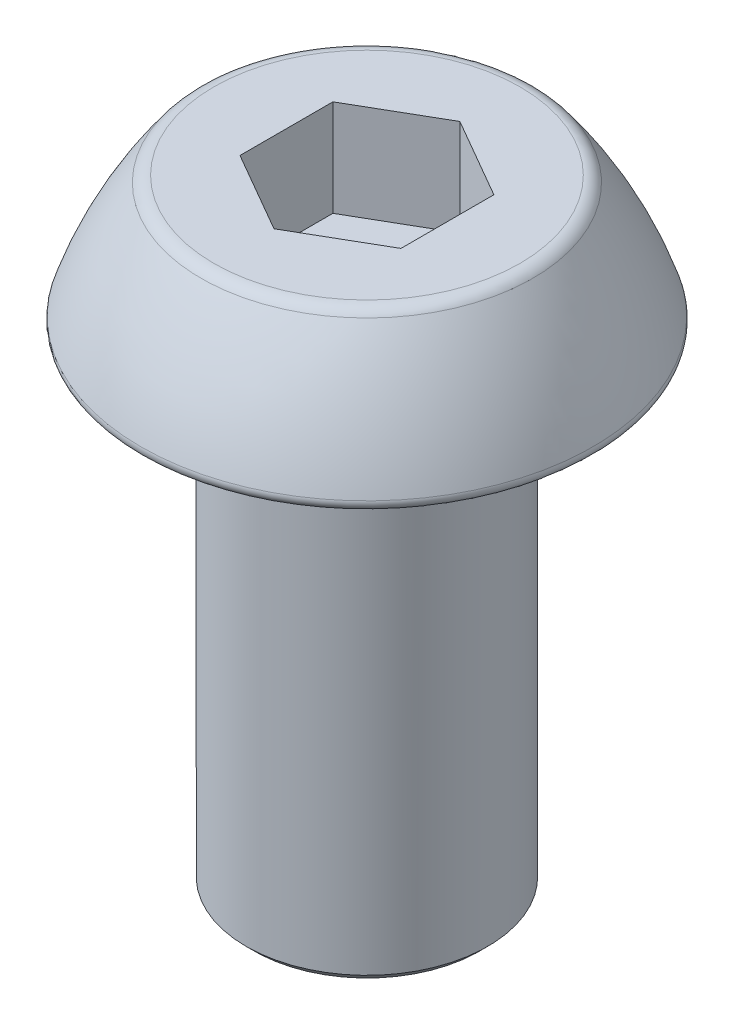
ISO-10303-21;
HEADER;
FILE_DESCRIPTION(('STEP AP214'),'2;1');
FILE_NAME('part.step','',(''),(''),'','','');
FILE_SCHEMA(('AUTOMOTIVE_DESIGN { 1 0 10303 214 1 1 1 1 }'));
ENDSEC;
DATA;
#1=APPLICATION_CONTEXT('core data for automotive mechanical design processes');
#2=APPLICATION_PROTOCOL_DEFINITION('international standard','automotive_design',2000,#1);
#3=PRODUCT_CONTEXT('',#1,'mechanical');
#4=PRODUCT('Part','Part','',(#3));
#5=PRODUCT_RELATED_PRODUCT_CATEGORY('part','',(#4));
#6=PRODUCT_DEFINITION_FORMATION('','',#4);
#7=PRODUCT_DEFINITION_CONTEXT('part definition',#1,'design');
#8=PRODUCT_DEFINITION('design','',#6,#7);
#9=PRODUCT_DEFINITION_SHAPE('','',#8);
#10=(LENGTH_UNIT() NAMED_UNIT(*) SI_UNIT(.MILLI.,.METRE.));
#11=(NAMED_UNIT(*) PLANE_ANGLE_UNIT() SI_UNIT($,.RADIAN.));
#12=(NAMED_UNIT(*) SI_UNIT($,.STERADIAN.) SOLID_ANGLE_UNIT());
#13=UNCERTAINTY_MEASURE_WITH_UNIT(LENGTH_MEASURE(1.E-05),#10,'distance_accuracy_value','');
#14=(GEOMETRIC_REPRESENTATION_CONTEXT(3) GLOBAL_UNCERTAINTY_ASSIGNED_CONTEXT((#13)) GLOBAL_UNIT_ASSIGNED_CONTEXT((#10,
#11,#12)) REPRESENTATION_CONTEXT('',''));
#15=CARTESIAN_POINT('',(0.,0.,0.));
#16=DIRECTION('',(0.,0.,1.));
#17=DIRECTION('',(1.,0.,0.));
#18=AXIS2_PLACEMENT_3D('',#15,#16,#17);
#19=CARTESIAN_POINT('',(0.,0.,0.));
#20=DIRECTION('',(0.,1.,0.));
#21=DIRECTION('',(0.,0.,1.));
#22=AXIS2_PLACEMENT_3D('',#19,#20,#21);
#23=PLANE('',#22);
#24=CARTESIAN_POINT('',(0.,0.,0.));
#25=DIRECTION('',(0.,1.,0.));
#26=DIRECTION('',(0.,0.,1.));
#27=AXIS2_PLACEMENT_3D('',#24,#25,#26);
#28=CIRCLE('',#27,2.71401101775283);
#29=CARTESIAN_POINT('',(0.,0.,2.71401101775283));
#30=VERTEX_POINT('',#29);
#31=EDGE_CURVE('E118',#30,#30,#28,.F.);
#32=ORIENTED_EDGE('',*,*,#31,.T.);
#33=EDGE_LOOP('',(#32));
#34=FACE_BOUND('',#33,.T.);
#35=CARTESIAN_POINT('',(0.,0.,0.));
#36=DIRECTION('',(0.,1.,0.));
#37=DIRECTION('',(0.,0.,1.));
#38=AXIS2_PLACEMENT_3D('',#35,#36,#37);
#39=CIRCLE('',#38,1.5);
#40=CARTESIAN_POINT('',(0.,0.,1.5));
#41=VERTEX_POINT('',#40);
#42=EDGE_CURVE('E137',#41,#41,#39,.F.);
#43=ORIENTED_EDGE('',*,*,#42,.F.);
#44=EDGE_LOOP('',(#43));
#45=FACE_BOUND('',#44,.T.);
#46=ADVANCED_FACE('F17',(#34,#45),#23,.F.);
#47=CARTESIAN_POINT('',(-2.,1.65,0.));
#48=DIRECTION('',(0.,-1.,0.));
#49=DIRECTION('',(0.,0.,-1.));
#50=AXIS2_PLACEMENT_3D('',#47,#48,#49);
#51=PLANE('',#50);
#52=DIRECTION('',(-0.866025403784439,0.,0.5));
#53=VECTOR('',#52,1.);
#54=CARTESIAN_POINT('',(0.,1.65,-1.15470053837925));
#55=LINE('',#54,#53);
#56=CARTESIAN_POINT('',(0.,1.65,-1.15470053837925));
#57=VERTEX_POINT('',#56);
#58=CARTESIAN_POINT('',(-1.,1.65,-0.577350269189626));
#59=VERTEX_POINT('',#58);
#60=EDGE_CURVE('E106',#57,#59,#55,.T.);
#61=ORIENTED_EDGE('',*,*,#60,.F.);
#62=DIRECTION('',(-0.866025403784439,0.,-0.5));
#63=VECTOR('',#62,1.);
#64=CARTESIAN_POINT('',(1.,1.65,-0.577350269189626));
#65=LINE('',#64,#63);
#66=CARTESIAN_POINT('',(1.,1.65,-0.577350269189626));
#67=VERTEX_POINT('',#66);
#68=EDGE_CURVE('E32',#67,#57,#65,.T.);
#69=ORIENTED_EDGE('',*,*,#68,.F.);
#70=DIRECTION('',(0.,0.,-1.));
#71=VECTOR('',#70,1.);
#72=CARTESIAN_POINT('',(1.,1.65,0.577350269189626));
#73=LINE('',#72,#71);
#74=CARTESIAN_POINT('',(1.,1.65,0.577350269189626));
#75=VERTEX_POINT('',#74);
#76=EDGE_CURVE('E113',#75,#67,#73,.T.);
#77=ORIENTED_EDGE('',*,*,#76,.F.);
#78=DIRECTION('',(0.866025403784439,0.,-0.5));
#79=VECTOR('',#78,1.);
#80=CARTESIAN_POINT('',(0.,1.65,1.15470053837925));
#81=LINE('',#80,#79);
#82=CARTESIAN_POINT('',(0.,1.65,1.15470053837925));
#83=VERTEX_POINT('',#82);
#84=EDGE_CURVE('E114',#83,#75,#81,.T.);
#85=ORIENTED_EDGE('',*,*,#84,.F.);
#86=DIRECTION('',(0.866025403784439,0.,0.5));
#87=VECTOR('',#86,1.);
#88=CARTESIAN_POINT('',(-1.,1.65,0.577350269189626));
#89=LINE('',#88,#87);
#90=CARTESIAN_POINT('',(-1.,1.65,0.577350269189626));
#91=VERTEX_POINT('',#90);
#92=EDGE_CURVE('E79',#91,#83,#89,.T.);
#93=ORIENTED_EDGE('',*,*,#92,.F.);
#94=DIRECTION('',(0.,0.,1.));
#95=VECTOR('',#94,1.);
#96=CARTESIAN_POINT('',(-1.,1.65,-0.577350269189626));
#97=LINE('',#96,#95);
#98=EDGE_CURVE('E108',#59,#91,#97,.T.);
#99=ORIENTED_EDGE('',*,*,#98,.F.);
#100=EDGE_LOOP('',(#61,#69,#77,#85,#93,#99));
#101=FACE_BOUND('',#100,.T.);
#102=CARTESIAN_POINT('',(0.,1.65,0.));
#103=DIRECTION('',(0.,-1.,0.));
#104=DIRECTION('',(0.,0.,-1.));
#105=AXIS2_PLACEMENT_3D('',#102,#103,#104);
#106=CIRCLE('',#105,1.90110924353599);
#107=CARTESIAN_POINT('',(0.,1.65,-1.90110924353599));
#108=VERTEX_POINT('',#107);
#109=EDGE_CURVE('E132',#108,#108,#106,.F.);
#110=ORIENTED_EDGE('',*,*,#109,.T.);
#111=EDGE_LOOP('',(#110));
#112=FACE_BOUND('',#111,.T.);
#113=ADVANCED_FACE('F152',(#101,#112),#51,.F.);
#114=CARTESIAN_POINT('',(0.,-1.42499576680782,0.));
#115=DIRECTION('',(0.,-1.,0.));
#116=DIRECTION('',(0.,0.,-1.));
#117=AXIS2_PLACEMENT_3D('',#114,#115,#116);
#118=DEGENERATE_TOROIDAL_SURFACE('',#117,1.94263884145048,5.,.F.);
#119=CARTESIAN_POINT('',(0.,1.56979149028366,0.));
#120=DIRECTION('',(0.,-1.,0.));
#121=DIRECTION('',(0.,0.,-1.));
#122=AXIS2_PLACEMENT_3D('',#119,#120,#121);
#123=CIRCLE('',#122,2.06126541374375);
#124=CARTESIAN_POINT('',(0.,1.56979149028366,-2.06126541374375));
#125=VERTEX_POINT('',#124);
#126=EDGE_CURVE('E129',#125,#125,#123,.T.);
#127=ORIENTED_EDGE('',*,*,#126,.T.);
#128=EDGE_LOOP('',(#127));
#129=FACE_BOUND('',#128,.T.);
#130=CARTESIAN_POINT('',(0.,0.131122362587915,0.));
#131=DIRECTION('',(0.,-1.,0.));
#132=DIRECTION('',(0.,0.,-1.));
#133=AXIS2_PLACEMENT_3D('',#130,#131,#132);
#134=CIRCLE('',#133,2.80904468834882);
#135=CARTESIAN_POINT('',(0.,0.131122362587915,-2.80904468834882));
#136=VERTEX_POINT('',#135);
#137=EDGE_CURVE('E126',#136,#136,#134,.F.);
#138=ORIENTED_EDGE('',*,*,#137,.T.);
#139=EDGE_LOOP('',(#138));
#140=FACE_BOUND('',#139,.T.);
#141=ADVANCED_FACE('F161',(#129,#140),#118,.F.);
#142=CARTESIAN_POINT('',(0.,0.1,0.));
#143=DIRECTION('',(0.,1.,0.));
#144=DIRECTION('',(0.,0.,1.));
#145=AXIS2_PLACEMENT_3D('',#142,#143,#144);
#146=TOROIDAL_SURFACE('',#145,2.71401101775283,0.1);
#147=ORIENTED_EDGE('',*,*,#137,.F.);
#148=EDGE_LOOP('',(#147));
#149=FACE_BOUND('',#148,.T.);
#150=ORIENTED_EDGE('',*,*,#31,.F.);
#151=EDGE_LOOP('',(#150));
#152=FACE_BOUND('',#151,.T.);
#153=ADVANCED_FACE('F168',(#149,#152),#146,.T.);
#154=CARTESIAN_POINT('',(0.,1.45,0.));
#155=DIRECTION('',(0.,-1.,0.));
#156=DIRECTION('',(0.,0.,-1.));
#157=AXIS2_PLACEMENT_3D('',#154,#155,#156);
#158=TOROIDAL_SURFACE('',#157,1.90110924353599,0.2);
#159=ORIENTED_EDGE('',*,*,#109,.F.);
#160=EDGE_LOOP('',(#159));
#161=FACE_BOUND('',#160,.T.);
#162=ORIENTED_EDGE('',*,*,#126,.F.);
#163=EDGE_LOOP('',(#162));
#164=FACE_BOUND('',#163,.T.);
#165=ADVANCED_FACE('F173',(#161,#164),#158,.T.);
#166=CARTESIAN_POINT('',(1.,0.45,-0.577350269189626));
#167=DIRECTION('',(0.5,0.,-0.866025403784439));
#168=DIRECTION('',(-0.866025403784439,0.,-0.5));
#169=AXIS2_PLACEMENT_3D('',#166,#167,#168);
#170=PLANE('',#169);
#171=ORIENTED_EDGE('',*,*,#68,.T.);
#172=DIRECTION('',(0.,1.,0.));
#173=VECTOR('',#172,1.);
#174=CARTESIAN_POINT('',(0.,0.45,-1.15470053837925));
#175=LINE('',#174,#173);
#176=CARTESIAN_POINT('',(0.,0.45,-1.15470053837925));
#177=VERTEX_POINT('',#176);
#178=EDGE_CURVE('E62',#177,#57,#175,.T.);
#179=ORIENTED_EDGE('',*,*,#178,.F.);
#180=DIRECTION('',(-0.866025403784439,0.,-0.5));
#181=VECTOR('',#180,1.);
#182=CARTESIAN_POINT('',(1.,0.45,-0.577350269189626));
#183=LINE('',#182,#181);
#184=CARTESIAN_POINT('',(1.,0.45,-0.577350269189626));
#185=VERTEX_POINT('',#184);
#186=EDGE_CURVE('E117',#185,#177,#183,.T.);
#187=ORIENTED_EDGE('',*,*,#186,.F.);
#188=DIRECTION('',(0.,1.,0.));
#189=VECTOR('',#188,1.);
#190=CARTESIAN_POINT('',(1.,0.45,-0.577350269189626));
#191=LINE('',#190,#189);
#192=EDGE_CURVE('E37',#185,#67,#191,.T.);
#193=ORIENTED_EDGE('',*,*,#192,.T.);
#194=EDGE_LOOP('',(#171,#179,#187,#193));
#195=FACE_BOUND('',#194,.T.);
#196=ADVANCED_FACE('F170',(#195),#170,.F.);
#197=CARTESIAN_POINT('',(1.,0.45,0.577350269189626));
#198=DIRECTION('',(1.,0.,0.));
#199=DIRECTION('',(0.,0.,-1.));
#200=AXIS2_PLACEMENT_3D('',#197,#198,#199);
#201=PLANE('',#200);
#202=ORIENTED_EDGE('',*,*,#76,.T.);
#203=ORIENTED_EDGE('',*,*,#192,.F.);
#204=DIRECTION('',(0.,0.,-1.));
#205=VECTOR('',#204,1.);
#206=CARTESIAN_POINT('',(1.,0.45,0.577350269189626));
#207=LINE('',#206,#205);
#208=CARTESIAN_POINT('',(1.,0.45,0.577350269189626));
#209=VERTEX_POINT('',#208);
#210=EDGE_CURVE('E95',#209,#185,#207,.T.);
#211=ORIENTED_EDGE('',*,*,#210,.F.);
#212=DIRECTION('',(0.,1.,0.));
#213=VECTOR('',#212,1.);
#214=CARTESIAN_POINT('',(1.,0.45,0.577350269189626));
#215=LINE('',#214,#213);
#216=EDGE_CURVE('E81',#209,#75,#215,.T.);
#217=ORIENTED_EDGE('',*,*,#216,.T.);
#218=EDGE_LOOP('',(#202,#203,#211,#217));
#219=FACE_BOUND('',#218,.T.);
#220=ADVANCED_FACE('F181',(#219),#201,.F.);
#221=CARTESIAN_POINT('',(0.,0.45,1.15470053837925));
#222=DIRECTION('',(0.5,0.,0.866025403784439));
#223=DIRECTION('',(0.866025403784439,0.,-0.5));
#224=AXIS2_PLACEMENT_3D('',#221,#222,#223);
#225=PLANE('',#224);
#226=ORIENTED_EDGE('',*,*,#84,.T.);
#227=ORIENTED_EDGE('',*,*,#216,.F.);
#228=DIRECTION('',(0.866025403784439,0.,-0.5));
#229=VECTOR('',#228,1.);
#230=CARTESIAN_POINT('',(0.,0.45,1.15470053837925));
#231=LINE('',#230,#229);
#232=CARTESIAN_POINT('',(0.,0.45,1.15470053837925));
#233=VERTEX_POINT('',#232);
#234=EDGE_CURVE('E86',#233,#209,#231,.T.);
#235=ORIENTED_EDGE('',*,*,#234,.F.);
#236=DIRECTION('',(0.,1.,0.));
#237=VECTOR('',#236,1.);
#238=CARTESIAN_POINT('',(0.,0.45,1.15470053837925));
#239=LINE('',#238,#237);
#240=EDGE_CURVE('E73',#233,#83,#239,.T.);
#241=ORIENTED_EDGE('',*,*,#240,.T.);
#242=EDGE_LOOP('',(#226,#227,#235,#241));
#243=FACE_BOUND('',#242,.T.);
#244=ADVANCED_FACE('F90',(#243),#225,.F.);
#245=CARTESIAN_POINT('',(-1.,0.45,0.577350269189626));
#246=DIRECTION('',(-0.5,0.,0.866025403784439));
#247=DIRECTION('',(0.866025403784439,0.,0.5));
#248=AXIS2_PLACEMENT_3D('',#245,#246,#247);
#249=PLANE('',#248);
#250=ORIENTED_EDGE('',*,*,#92,.T.);
#251=ORIENTED_EDGE('',*,*,#240,.F.);
#252=DIRECTION('',(0.866025403784439,0.,0.5));
#253=VECTOR('',#252,1.);
#254=CARTESIAN_POINT('',(-1.,0.45,0.577350269189626));
#255=LINE('',#254,#253);
#256=CARTESIAN_POINT('',(-1.,0.45,0.577350269189626));
#257=VERTEX_POINT('',#256);
#258=EDGE_CURVE('E80',#257,#233,#255,.T.);
#259=ORIENTED_EDGE('',*,*,#258,.F.);
#260=DIRECTION('',(0.,1.,0.));
#261=VECTOR('',#260,1.);
#262=CARTESIAN_POINT('',(-1.,0.45,0.577350269189626));
#263=LINE('',#262,#261);
#264=EDGE_CURVE('E83',#257,#91,#263,.T.);
#265=ORIENTED_EDGE('',*,*,#264,.T.);
#266=EDGE_LOOP('',(#250,#251,#259,#265));
#267=FACE_BOUND('',#266,.T.);
#268=ADVANCED_FACE('F74',(#267),#249,.F.);
#269=CARTESIAN_POINT('',(-1.,0.45,-0.577350269189626));
#270=DIRECTION('',(-1.,0.,0.));
#271=DIRECTION('',(0.,0.,1.));
#272=AXIS2_PLACEMENT_3D('',#269,#270,#271);
#273=PLANE('',#272);
#274=ORIENTED_EDGE('',*,*,#98,.T.);
#275=ORIENTED_EDGE('',*,*,#264,.F.);
#276=DIRECTION('',(0.,0.,1.));
#277=VECTOR('',#276,1.);
#278=CARTESIAN_POINT('',(-1.,0.45,-0.577350269189626));
#279=LINE('',#278,#277);
#280=CARTESIAN_POINT('',(-1.,0.45,-0.577350269189626));
#281=VERTEX_POINT('',#280);
#282=EDGE_CURVE('E98',#281,#257,#279,.T.);
#283=ORIENTED_EDGE('',*,*,#282,.F.);
#284=DIRECTION('',(0.,1.,0.));
#285=VECTOR('',#284,1.);
#286=CARTESIAN_POINT('',(-1.,0.45,-0.577350269189626));
#287=LINE('',#286,#285);
#288=EDGE_CURVE('E121',#281,#59,#287,.T.);
#289=ORIENTED_EDGE('',*,*,#288,.T.);
#290=EDGE_LOOP('',(#274,#275,#283,#289));
#291=FACE_BOUND('',#290,.T.);
#292=ADVANCED_FACE('F206',(#291),#273,.F.);
#293=CARTESIAN_POINT('',(0.,0.45,-1.15470053837925));
#294=DIRECTION('',(-0.5,0.,-0.866025403784439));
#295=DIRECTION('',(-0.866025403784439,0.,0.5));
#296=AXIS2_PLACEMENT_3D('',#293,#294,#295);
#297=PLANE('',#296);
#298=ORIENTED_EDGE('',*,*,#60,.T.);
#299=ORIENTED_EDGE('',*,*,#288,.F.);
#300=DIRECTION('',(-0.866025403784439,0.,0.5));
#301=VECTOR('',#300,1.);
#302=CARTESIAN_POINT('',(0.,0.45,-1.15470053837925));
#303=LINE('',#302,#301);
#304=EDGE_CURVE('E99',#177,#281,#303,.T.);
#305=ORIENTED_EDGE('',*,*,#304,.F.);
#306=ORIENTED_EDGE('',*,*,#178,.T.);
#307=EDGE_LOOP('',(#298,#299,#305,#306));
#308=FACE_BOUND('',#307,.T.);
#309=ADVANCED_FACE('F208',(#308),#297,.F.);
#310=CARTESIAN_POINT('',(0.,0.45,0.));
#311=DIRECTION('',(0.,1.,0.));
#312=DIRECTION('',(0.,0.,1.));
#313=AXIS2_PLACEMENT_3D('',#310,#311,#312);
#314=PLANE('',#313);
#315=ORIENTED_EDGE('',*,*,#186,.T.);
#316=ORIENTED_EDGE('',*,*,#304,.T.);
#317=ORIENTED_EDGE('',*,*,#282,.T.);
#318=ORIENTED_EDGE('',*,*,#258,.T.);
#319=ORIENTED_EDGE('',*,*,#234,.T.);
#320=ORIENTED_EDGE('',*,*,#210,.T.);
#321=EDGE_LOOP('',(#315,#316,#317,#318,#319,#320));
#322=FACE_BOUND('',#321,.T.);
#323=ADVANCED_FACE('F92',(#322),#314,.T.);
#324=CARTESIAN_POINT('',(0.,-6.,0.));
#325=DIRECTION('',(0.,1.,0.));
#326=DIRECTION('',(0.,0.,1.));
#327=AXIS2_PLACEMENT_3D('',#324,#325,#326);
#328=CYLINDRICAL_SURFACE('',#327,1.5);
#329=CARTESIAN_POINT('',(0.,-5.9,0.));
#330=DIRECTION('',(0.,-1.,0.));
#331=DIRECTION('',(0.,0.,-1.));
#332=AXIS2_PLACEMENT_3D('',#329,#330,#331);
#333=CIRCLE('',#332,1.5);
#334=CARTESIAN_POINT('',(0.,-5.9,-1.5));
#335=VERTEX_POINT('',#334);
#336=EDGE_CURVE('E11',#335,#335,#333,.F.);
#337=ORIENTED_EDGE('',*,*,#336,.T.);
#338=EDGE_LOOP('',(#337));
#339=FACE_BOUND('',#338,.T.);
#340=ORIENTED_EDGE('',*,*,#42,.T.);
#341=EDGE_LOOP('',(#340));
#342=FACE_BOUND('',#341,.T.);
#343=ADVANCED_FACE('F147',(#339,#342),#328,.T.);
#344=CARTESIAN_POINT('',(0.,-6.,0.));
#345=DIRECTION('',(0.,-1.,0.));
#346=DIRECTION('',(0.,0.,-1.));
#347=AXIS2_PLACEMENT_3D('',#344,#345,#346);
#348=PLANE('',#347);
#349=CARTESIAN_POINT('',(0.,-6.,0.));
#350=DIRECTION('',(0.,-1.,0.));
#351=DIRECTION('',(0.,0.,-1.));
#352=AXIS2_PLACEMENT_3D('',#349,#350,#351);
#353=CIRCLE('',#352,1.4);
#354=CARTESIAN_POINT('',(0.,-6.,-1.4));
#355=VERTEX_POINT('',#354);
#356=EDGE_CURVE('E25',#355,#355,#353,.T.);
#357=ORIENTED_EDGE('',*,*,#356,.T.);
#358=EDGE_LOOP('',(#357));
#359=FACE_BOUND('',#358,.T.);
#360=ADVANCED_FACE('F143',(#359),#348,.T.);
#361=CARTESIAN_POINT('',(0.,-6.,0.));
#362=DIRECTION('',(0.,1.,0.));
#363=DIRECTION('',(0.,0.,1.));
#364=AXIS2_PLACEMENT_3D('',#361,#362,#363);
#365=CONICAL_SURFACE('',#364,1.4,0.785398163397444);
#366=ORIENTED_EDGE('',*,*,#336,.F.);
#367=EDGE_LOOP('',(#366));
#368=FACE_BOUND('',#367,.T.);
#369=ORIENTED_EDGE('',*,*,#356,.F.);
#370=EDGE_LOOP('',(#369));
#371=FACE_BOUND('',#370,.T.);
#372=ADVANCED_FACE('F19',(#368,#371),#365,.T.);
#373=CLOSED_SHELL('',(#46,#113,#141,#153,#165,#196,#220,#244,#268,#292,#309,#323,#343,#360,#372));
#374=MANIFOLD_SOLID_BREP('B1',#373);
#375=ADVANCED_BREP_SHAPE_REPRESENTATION('',(#18,#374),#14);
#376=SHAPE_DEFINITION_REPRESENTATION(#9,#375);
ENDSEC;
END-ISO-10303-21;
